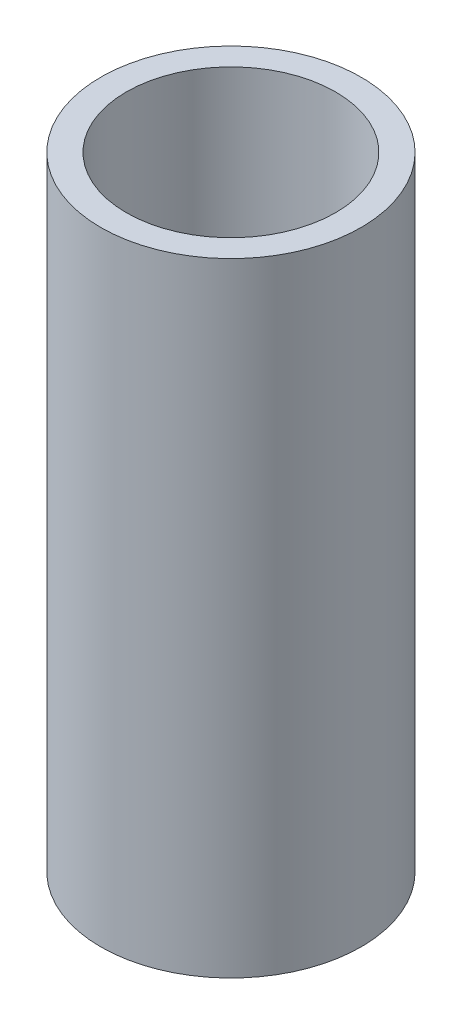
ISO-10303-21;
HEADER;
FILE_DESCRIPTION(('STEP AP214'),'2;1');
FILE_NAME('part.step','',(''),(''),'','','');
FILE_SCHEMA(('AUTOMOTIVE_DESIGN { 1 0 10303 214 1 1 1 1 }'));
ENDSEC;
DATA;
#1=APPLICATION_CONTEXT('core data for automotive mechanical design processes');
#2=APPLICATION_PROTOCOL_DEFINITION('international standard','automotive_design',2000,#1);
#3=PRODUCT_CONTEXT('',#1,'mechanical');
#4=PRODUCT('Part','Part','',(#3));
#5=PRODUCT_RELATED_PRODUCT_CATEGORY('part','',(#4));
#6=PRODUCT_DEFINITION_FORMATION('','',#4);
#7=PRODUCT_DEFINITION_CONTEXT('part definition',#1,'design');
#8=PRODUCT_DEFINITION('design','',#6,#7);
#9=PRODUCT_DEFINITION_SHAPE('','',#8);
#10=(LENGTH_UNIT() NAMED_UNIT(*) SI_UNIT(.MILLI.,.METRE.));
#11=(NAMED_UNIT(*) PLANE_ANGLE_UNIT() SI_UNIT($,.RADIAN.));
#12=(NAMED_UNIT(*) SI_UNIT($,.STERADIAN.) SOLID_ANGLE_UNIT());
#13=UNCERTAINTY_MEASURE_WITH_UNIT(LENGTH_MEASURE(1.E-05),#10,'distance_accuracy_value','');
#14=(GEOMETRIC_REPRESENTATION_CONTEXT(3) GLOBAL_UNCERTAINTY_ASSIGNED_CONTEXT((#13)) GLOBAL_UNIT_ASSIGNED_CONTEXT((#10,
#11,#12)) REPRESENTATION_CONTEXT('',''));
#15=CARTESIAN_POINT('',(0.,0.,0.));
#16=DIRECTION('',(0.,0.,1.));
#17=DIRECTION('',(1.,0.,0.));
#18=AXIS2_PLACEMENT_3D('',#15,#16,#17);
#19=CARTESIAN_POINT('',(0.,19.5,0.));
#20=DIRECTION('',(0.,1.,0.));
#21=DIRECTION('',(0.,0.,1.));
#22=AXIS2_PLACEMENT_3D('',#19,#20,#21);
#23=PLANE('',#22);
#24=CARTESIAN_POINT('',(0.,19.5,0.));
#25=DIRECTION('',(0.,1.,0.));
#26=DIRECTION('',(0.,0.,1.));
#27=AXIS2_PLACEMENT_3D('',#24,#25,#26);
#28=CIRCLE('',#27,4.075);
#29=CARTESIAN_POINT('',(0.,19.5,4.075));
#30=VERTEX_POINT('',#29);
#31=EDGE_CURVE('E10',#30,#30,#28,.T.);
#32=ORIENTED_EDGE('',*,*,#31,.T.);
#33=EDGE_LOOP('',(#32));
#34=FACE_BOUND('',#33,.T.);
#35=CARTESIAN_POINT('',(0.,19.5,0.));
#36=DIRECTION('',(0.,1.,0.));
#37=DIRECTION('',(0.,0.,1.));
#38=AXIS2_PLACEMENT_3D('',#35,#36,#37);
#39=CIRCLE('',#38,3.275);
#40=CARTESIAN_POINT('',(0.,19.5,3.275));
#41=VERTEX_POINT('',#40);
#42=EDGE_CURVE('E42',#41,#41,#39,.T.);
#43=ORIENTED_EDGE('',*,*,#42,.F.);
#44=EDGE_LOOP('',(#43));
#45=FACE_BOUND('',#44,.T.);
#46=ADVANCED_FACE('F31',(#34,#45),#23,.T.);
#47=CARTESIAN_POINT('',(0.,0.,0.));
#48=DIRECTION('',(0.,1.,0.));
#49=DIRECTION('',(0.,0.,1.));
#50=AXIS2_PLACEMENT_3D('',#47,#48,#49);
#51=PLANE('',#50);
#52=CARTESIAN_POINT('',(0.,0.,0.));
#53=DIRECTION('',(0.,1.,0.));
#54=DIRECTION('',(0.,0.,1.));
#55=AXIS2_PLACEMENT_3D('',#52,#53,#54);
#56=CIRCLE('',#55,4.075);
#57=CARTESIAN_POINT('',(0.,0.,4.075));
#58=VERTEX_POINT('',#57);
#59=EDGE_CURVE('E35',#58,#58,#56,.T.);
#60=ORIENTED_EDGE('',*,*,#59,.F.);
#61=EDGE_LOOP('',(#60));
#62=FACE_BOUND('',#61,.T.);
#63=CARTESIAN_POINT('',(0.,0.,0.));
#64=DIRECTION('',(0.,1.,0.));
#65=DIRECTION('',(0.,0.,1.));
#66=AXIS2_PLACEMENT_3D('',#63,#64,#65);
#67=CIRCLE('',#66,3.275);
#68=CARTESIAN_POINT('',(0.,0.,3.275));
#69=VERTEX_POINT('',#68);
#70=EDGE_CURVE('E44',#69,#69,#67,.T.);
#71=ORIENTED_EDGE('',*,*,#70,.T.);
#72=EDGE_LOOP('',(#71));
#73=FACE_BOUND('',#72,.T.);
#74=ADVANCED_FACE('F54',(#62,#73),#51,.F.);
#75=CARTESIAN_POINT('',(0.,19.5,0.));
#76=DIRECTION('',(0.,-1.,0.));
#77=DIRECTION('',(0.,0.,-1.));
#78=AXIS2_PLACEMENT_3D('',#75,#76,#77);
#79=CYLINDRICAL_SURFACE('',#78,4.075);
#80=ORIENTED_EDGE('',*,*,#31,.F.);
#81=EDGE_LOOP('',(#80));
#82=FACE_BOUND('',#81,.T.);
#83=ORIENTED_EDGE('',*,*,#59,.T.);
#84=EDGE_LOOP('',(#83));
#85=FACE_BOUND('',#84,.T.);
#86=ADVANCED_FACE('F33',(#82,#85),#79,.T.);
#87=CARTESIAN_POINT('',(0.,19.5,0.));
#88=DIRECTION('',(0.,-1.,0.));
#89=DIRECTION('',(0.,0.,-1.));
#90=AXIS2_PLACEMENT_3D('',#87,#88,#89);
#91=CYLINDRICAL_SURFACE('',#90,3.275);
#92=ORIENTED_EDGE('',*,*,#42,.T.);
#93=EDGE_LOOP('',(#92));
#94=FACE_BOUND('',#93,.T.);
#95=ORIENTED_EDGE('',*,*,#70,.F.);
#96=EDGE_LOOP('',(#95));
#97=FACE_BOUND('',#96,.T.);
#98=ADVANCED_FACE('F50',(#94,#97),#91,.F.);
#99=CLOSED_SHELL('',(#46,#74,#86,#98));
#100=MANIFOLD_SOLID_BREP('B2',#99);
#101=ADVANCED_BREP_SHAPE_REPRESENTATION('',(#18,#100),#14);
#102=SHAPE_DEFINITION_REPRESENTATION(#9,#101);
ENDSEC;
END-ISO-10303-21;
